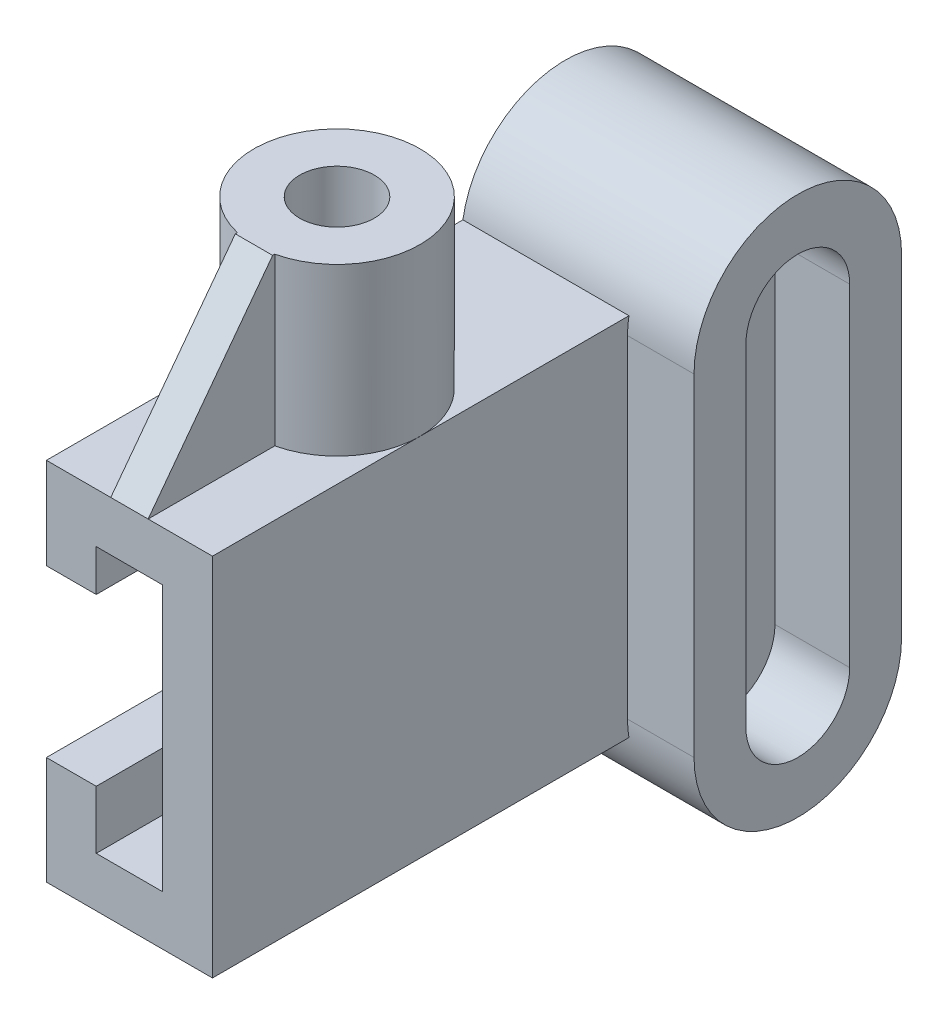
ISO-10303-21;
HEADER;
FILE_DESCRIPTION(('STEP AP214'),'2;1');
FILE_NAME('part.step','',(''),(''),'','','');
FILE_SCHEMA(('AUTOMOTIVE_DESIGN { 1 0 10303 214 1 1 1 1 }'));
ENDSEC;
DATA;
#1=APPLICATION_CONTEXT('core data for automotive mechanical design processes');
#2=APPLICATION_PROTOCOL_DEFINITION('international standard','automotive_design',2000,#1);
#3=PRODUCT_CONTEXT('',#1,'mechanical');
#4=PRODUCT('Part','Part','',(#3));
#5=PRODUCT_RELATED_PRODUCT_CATEGORY('part','',(#4));
#6=PRODUCT_DEFINITION_FORMATION('','',#4);
#7=PRODUCT_DEFINITION_CONTEXT('part definition',#1,'design');
#8=PRODUCT_DEFINITION('design','',#6,#7);
#9=PRODUCT_DEFINITION_SHAPE('','',#8);
#10=(LENGTH_UNIT() NAMED_UNIT(*) SI_UNIT(.MILLI.,.METRE.));
#11=(NAMED_UNIT(*) PLANE_ANGLE_UNIT() SI_UNIT($,.RADIAN.));
#12=(NAMED_UNIT(*) SI_UNIT($,.STERADIAN.) SOLID_ANGLE_UNIT());
#13=UNCERTAINTY_MEASURE_WITH_UNIT(LENGTH_MEASURE(1.E-05),#10,'distance_accuracy_value','');
#14=(GEOMETRIC_REPRESENTATION_CONTEXT(3) GLOBAL_UNCERTAINTY_ASSIGNED_CONTEXT((#13)) GLOBAL_UNIT_ASSIGNED_CONTEXT((#10,
#11,#12)) REPRESENTATION_CONTEXT('',''));
#15=CARTESIAN_POINT('',(0.,0.,0.));
#16=DIRECTION('',(0.,0.,1.));
#17=DIRECTION('',(1.,0.,0.));
#18=AXIS2_PLACEMENT_3D('',#15,#16,#17);
#19=CARTESIAN_POINT('',(-28.,44.,21.));
#20=DIRECTION('',(0.,1.,0.));
#21=DIRECTION('',(0.,0.,1.));
#22=AXIS2_PLACEMENT_3D('',#19,#20,#21);
#23=PLANE('',#22);
#24=CARTESIAN_POINT('',(-8.,44.,75.));
#25=DIRECTION('',(0.,1.,0.));
#26=DIRECTION('',(0.,0.,1.));
#27=AXIS2_PLACEMENT_3D('',#24,#25,#26);
#28=CIRCLE('',#27,20.);
#29=CARTESIAN_POINT('',(-3.5,44.,94.4871752699051));
#30=VERTEX_POINT('',#29);
#31=CARTESIAN_POINT('',(12.,44.,75.));
#32=VERTEX_POINT('',#31);
#33=EDGE_CURVE('E250',#30,#32,#28,.T.);
#34=ORIENTED_EDGE('',*,*,#33,.F.);
#35=DIRECTION('',(0.,0.,1.));
#36=VECTOR('',#35,1.);
#37=CARTESIAN_POINT('',(-3.5,44.,21.));
#38=LINE('',#37,#36);
#39=CARTESIAN_POINT('',(-3.5,44.,125.));
#40=VERTEX_POINT('',#39);
#41=EDGE_CURVE('E64',#30,#40,#38,.T.);
#42=ORIENTED_EDGE('',*,*,#41,.T.);
#43=DIRECTION('',(-1.,0.,0.));
#44=VECTOR('',#43,1.);
#45=CARTESIAN_POINT('',(-28.,44.,125.));
#46=LINE('',#45,#44);
#47=CARTESIAN_POINT('',(12.,44.,125.));
#48=VERTEX_POINT('',#47);
#49=EDGE_CURVE('E285',#48,#40,#46,.T.);
#50=ORIENTED_EDGE('',*,*,#49,.F.);
#51=DIRECTION('',(0.,0.,1.));
#52=VECTOR('',#51,1.);
#53=CARTESIAN_POINT('',(12.,44.,21.));
#54=LINE('',#53,#52);
#55=EDGE_CURVE('E296',#32,#48,#54,.T.);
#56=ORIENTED_EDGE('',*,*,#55,.F.);
#57=EDGE_LOOP('',(#34,#42,#50,#56));
#58=FACE_BOUND('',#57,.T.);
#59=ADVANCED_FACE('F41',(#58),#23,.T.);
#60=DIRECTION('',(0.,0.,1.));
#61=VECTOR('',#60,1.);
#62=CARTESIAN_POINT('',(-28.,44.,21.));
#63=LINE('',#62,#61);
#64=CARTESIAN_POINT('',(-28.,44.,24.6779253585061));
#65=VERTEX_POINT('',#64);
#66=CARTESIAN_POINT('',(-28.,44.,75.));
#67=VERTEX_POINT('',#66);
#68=EDGE_CURVE('E288',#65,#67,#63,.T.);
#69=ORIENTED_EDGE('',*,*,#68,.T.);
#70=EDGE_CURVE('E253',#32,#67,#28,.T.);
#71=ORIENTED_EDGE('',*,*,#70,.F.);
#72=CARTESIAN_POINT('',(12.,44.,24.6779253585061));
#73=VERTEX_POINT('',#72);
#74=EDGE_CURVE('E293',#73,#32,#54,.T.);
#75=ORIENTED_EDGE('',*,*,#74,.F.);
#76=DIRECTION('',(-1.,0.,0.));
#77=VECTOR('',#76,1.);
#78=CARTESIAN_POINT('',(28.,44.,24.6779253585061));
#79=LINE('',#78,#77);
#80=EDGE_CURVE('E49',#65,#73,#79,.F.);
#81=ORIENTED_EDGE('',*,*,#80,.F.);
#82=EDGE_LOOP('',(#69,#71,#75,#81));
#83=FACE_BOUND('',#82,.T.);
#84=ADVANCED_FACE('F412',(#83),#23,.T.);
#85=CARTESIAN_POINT('',(28.,40.,25.));
#86=DIRECTION('',(0.,0.,-1.));
#87=DIRECTION('',(0.,1.,0.));
#88=AXIS2_PLACEMENT_3D('',#85,#86,#87);
#89=PLANE('',#88);
#90=DIRECTION('',(-1.,0.,0.));
#91=VECTOR('',#90,1.);
#92=CARTESIAN_POINT('',(28.,40.,25.));
#93=LINE('',#92,#91);
#94=CARTESIAN_POINT('',(28.,40.,25.));
#95=VERTEX_POINT('',#94);
#96=CARTESIAN_POINT('',(12.,40.,25.));
#97=VERTEX_POINT('',#96);
#98=EDGE_CURVE('E379',#95,#97,#93,.T.);
#99=ORIENTED_EDGE('',*,*,#98,.T.);
#100=DIRECTION('',(0.,-1.,0.));
#101=VECTOR('',#100,1.);
#102=CARTESIAN_POINT('',(12.,40.,25.));
#103=LINE('',#102,#101);
#104=CARTESIAN_POINT('',(12.,-40.,25.));
#105=VERTEX_POINT('',#104);
#106=EDGE_CURVE('E291',#97,#105,#103,.T.);
#107=ORIENTED_EDGE('',*,*,#106,.T.);
#108=DIRECTION('',(-1.,0.,0.));
#109=VECTOR('',#108,1.);
#110=CARTESIAN_POINT('',(28.,-40.,25.));
#111=LINE('',#110,#109);
#112=CARTESIAN_POINT('',(28.,-40.,25.));
#113=VERTEX_POINT('',#112);
#114=EDGE_CURVE('E376',#113,#105,#111,.T.);
#115=ORIENTED_EDGE('',*,*,#114,.F.);
#116=DIRECTION('',(0.,-1.,0.));
#117=VECTOR('',#116,1.);
#118=CARTESIAN_POINT('',(28.,40.,25.));
#119=LINE('',#118,#117);
#120=EDGE_CURVE('E357',#95,#113,#119,.T.);
#121=ORIENTED_EDGE('',*,*,#120,.F.);
#122=EDGE_LOOP('',(#99,#107,#115,#121));
#123=FACE_BOUND('',#122,.T.);
#124=ADVANCED_FACE('F434',(#123),#89,.F.);
#125=CARTESIAN_POINT('',(28.,40.,0.));
#126=DIRECTION('',(1.,0.,0.));
#127=DIRECTION('',(0.,0.,-1.));
#128=AXIS2_PLACEMENT_3D('',#125,#126,#127);
#129=PLANE('',#128);
#130=CARTESIAN_POINT('',(28.,40.,0.));
#131=DIRECTION('',(1.,0.,0.));
#132=DIRECTION('',(0.,0.,-1.));
#133=AXIS2_PLACEMENT_3D('',#130,#131,#132);
#134=CIRCLE('',#133,25.);
#135=CARTESIAN_POINT('',(28.,40.,-25.));
#136=VERTEX_POINT('',#135);
#137=EDGE_CURVE('E354',#136,#95,#134,.T.);
#138=ORIENTED_EDGE('',*,*,#137,.T.);
#139=ORIENTED_EDGE('',*,*,#120,.T.);
#140=CARTESIAN_POINT('',(28.,-40.,0.));
#141=DIRECTION('',(1.,0.,0.));
#142=DIRECTION('',(0.,0.,-1.));
#143=AXIS2_PLACEMENT_3D('',#140,#141,#142);
#144=CIRCLE('',#143,25.);
#145=CARTESIAN_POINT('',(28.,-40.,-25.));
#146=VERTEX_POINT('',#145);
#147=EDGE_CURVE('E360',#113,#146,#144,.T.);
#148=ORIENTED_EDGE('',*,*,#147,.T.);
#149=DIRECTION('',(0.,1.,0.));
#150=VECTOR('',#149,1.);
#151=CARTESIAN_POINT('',(28.,40.,-25.));
#152=LINE('',#151,#150);
#153=EDGE_CURVE('E362',#146,#136,#152,.T.);
#154=ORIENTED_EDGE('',*,*,#153,.T.);
#155=EDGE_LOOP('',(#138,#139,#148,#154));
#156=FACE_BOUND('',#155,.T.);
#157=DIRECTION('',(0.,-1.,0.));
#158=VECTOR('',#157,1.);
#159=CARTESIAN_POINT('',(28.,40.,12.5));
#160=LINE('',#159,#158);
#161=CARTESIAN_POINT('',(28.,40.,12.5));
#162=VERTEX_POINT('',#161);
#163=CARTESIAN_POINT('',(28.,-40.,12.5));
#164=VERTEX_POINT('',#163);
#165=EDGE_CURVE('E335',#162,#164,#160,.T.);
#166=ORIENTED_EDGE('',*,*,#165,.F.);
#167=CARTESIAN_POINT('',(28.,40.,0.));
#168=DIRECTION('',(1.,0.,0.));
#169=DIRECTION('',(0.,0.,-1.));
#170=AXIS2_PLACEMENT_3D('',#167,#168,#169);
#171=CIRCLE('',#170,12.5);
#172=CARTESIAN_POINT('',(28.,40.,-12.5));
#173=VERTEX_POINT('',#172);
#174=EDGE_CURVE('E333',#173,#162,#171,.T.);
#175=ORIENTED_EDGE('',*,*,#174,.F.);
#176=DIRECTION('',(0.,1.,0.));
#177=VECTOR('',#176,1.);
#178=CARTESIAN_POINT('',(28.,40.,-12.5));
#179=LINE('',#178,#177);
#180=CARTESIAN_POINT('',(28.,-40.,-12.5));
#181=VERTEX_POINT('',#180);
#182=EDGE_CURVE('E340',#181,#173,#179,.T.);
#183=ORIENTED_EDGE('',*,*,#182,.F.);
#184=CARTESIAN_POINT('',(28.,-40.,0.));
#185=DIRECTION('',(1.,0.,0.));
#186=DIRECTION('',(0.,0.,-1.));
#187=AXIS2_PLACEMENT_3D('',#184,#185,#186);
#188=CIRCLE('',#187,12.5);
#189=EDGE_CURVE('E337',#164,#181,#188,.T.);
#190=ORIENTED_EDGE('',*,*,#189,.F.);
#191=EDGE_LOOP('',(#166,#175,#183,#190));
#192=FACE_BOUND('',#191,.T.);
#193=ADVANCED_FACE('F438',(#156,#192),#129,.T.);
#194=CARTESIAN_POINT('',(-28.,40.,0.));
#195=DIRECTION('',(1.,0.,0.));
#196=DIRECTION('',(0.,0.,-1.));
#197=AXIS2_PLACEMENT_3D('',#194,#195,#196);
#198=PLANE('',#197);
#199=ORIENTED_EDGE('',*,*,#68,.F.);
#200=CARTESIAN_POINT('',(-28.,40.,0.));
#201=DIRECTION('',(1.,0.,0.));
#202=DIRECTION('',(0.,0.,-1.));
#203=AXIS2_PLACEMENT_3D('',#200,#201,#202);
#204=CIRCLE('',#203,25.);
#205=CARTESIAN_POINT('',(-28.,40.,-25.));
#206=VERTEX_POINT('',#205);
#207=EDGE_CURVE('E353',#206,#65,#204,.T.);
#208=ORIENTED_EDGE('',*,*,#207,.F.);
#209=DIRECTION('',(0.,1.,0.));
#210=VECTOR('',#209,1.);
#211=CARTESIAN_POINT('',(-28.,40.,-25.));
#212=LINE('',#211,#210);
#213=CARTESIAN_POINT('',(-28.,-40.,-25.));
#214=VERTEX_POINT('',#213);
#215=EDGE_CURVE('E358',#214,#206,#212,.T.);
#216=ORIENTED_EDGE('',*,*,#215,.F.);
#217=CARTESIAN_POINT('',(-28.,-40.,0.));
#218=DIRECTION('',(1.,0.,0.));
#219=DIRECTION('',(0.,0.,-1.));
#220=AXIS2_PLACEMENT_3D('',#217,#218,#219);
#221=CIRCLE('',#220,25.);
#222=CARTESIAN_POINT('',(-28.,-44.,24.6779253585061));
#223=VERTEX_POINT('',#222);
#224=EDGE_CURVE('E368',#223,#214,#221,.T.);
#225=ORIENTED_EDGE('',*,*,#224,.F.);
#226=DIRECTION('',(0.,0.,1.));
#227=VECTOR('',#226,1.);
#228=CARTESIAN_POINT('',(-28.,-44.,21.));
#229=LINE('',#228,#227);
#230=CARTESIAN_POINT('',(-28.,-44.,125.));
#231=VERTEX_POINT('',#230);
#232=EDGE_CURVE('E300',#223,#231,#229,.T.);
#233=ORIENTED_EDGE('',*,*,#232,.T.);
#234=DIRECTION('',(0.,-1.,0.));
#235=VECTOR('',#234,1.);
#236=CARTESIAN_POINT('',(-28.,-44.,125.));
#237=LINE('',#236,#235);
#238=CARTESIAN_POINT('',(-28.,-18.,125.));
#239=VERTEX_POINT('',#238);
#240=EDGE_CURVE('E277',#239,#231,#237,.T.);
#241=ORIENTED_EDGE('',*,*,#240,.F.);
#242=DIRECTION('',(0.,0.,1.));
#243=VECTOR('',#242,1.);
#244=CARTESIAN_POINT('',(-28.,-18.,21.));
#245=LINE('',#244,#243);
#246=CARTESIAN_POINT('',(-28.,-18.,25.));
#247=VERTEX_POINT('',#246);
#248=EDGE_CURVE('E302',#247,#239,#245,.T.);
#249=ORIENTED_EDGE('',*,*,#248,.F.);
#250=DIRECTION('',(0.,-1.,0.));
#251=VECTOR('',#250,1.);
#252=CARTESIAN_POINT('',(-28.,40.,25.));
#253=LINE('',#252,#251);
#254=CARTESIAN_POINT('',(-28.,22.,25.));
#255=VERTEX_POINT('',#254);
#256=EDGE_CURVE('E366',#255,#247,#253,.T.);
#257=ORIENTED_EDGE('',*,*,#256,.F.);
#258=DIRECTION('',(0.,0.,1.));
#259=VECTOR('',#258,1.);
#260=CARTESIAN_POINT('',(-28.,22.,21.));
#261=LINE('',#260,#259);
#262=CARTESIAN_POINT('',(-28.,22.,125.));
#263=VERTEX_POINT('',#262);
#264=EDGE_CURVE('E287',#255,#263,#261,.T.);
#265=ORIENTED_EDGE('',*,*,#264,.T.);
#266=DIRECTION('',(0.,-1.,0.));
#267=VECTOR('',#266,1.);
#268=CARTESIAN_POINT('',(-28.,22.,125.));
#269=LINE('',#268,#267);
#270=CARTESIAN_POINT('',(-28.,44.,125.));
#271=VERTEX_POINT('',#270);
#272=EDGE_CURVE('E252',#271,#263,#269,.T.);
#273=ORIENTED_EDGE('',*,*,#272,.F.);
#274=EDGE_CURVE('E292',#67,#271,#63,.T.);
#275=ORIENTED_EDGE('',*,*,#274,.F.);
#276=EDGE_LOOP('',(#199,#208,#216,#225,#233,#241,#249,#257,#265,#273,#275));
#277=FACE_BOUND('',#276,.T.);
#278=ADVANCED_FACE('F445',(#277),#198,.F.);
#279=CARTESIAN_POINT('',(28.,40.,0.));
#280=DIRECTION('',(-1.,0.,0.));
#281=DIRECTION('',(0.,0.,1.));
#282=AXIS2_PLACEMENT_3D('',#279,#280,#281);
#283=CYLINDRICAL_SURFACE('',#282,25.);
#284=ORIENTED_EDGE('',*,*,#80,.T.);
#285=CARTESIAN_POINT('',(12.,40.,0.));
#286=DIRECTION('',(1.,0.,0.));
#287=DIRECTION('',(0.,1.,0.));
#288=AXIS2_PLACEMENT_3D('',#285,#286,#287);
#289=CIRCLE('',#288,25.);
#290=EDGE_CURVE('E320',#73,#97,#289,.T.);
#291=ORIENTED_EDGE('',*,*,#290,.T.);
#292=ORIENTED_EDGE('',*,*,#98,.F.);
#293=ORIENTED_EDGE('',*,*,#137,.F.);
#294=DIRECTION('',(-1.,0.,0.));
#295=VECTOR('',#294,1.);
#296=CARTESIAN_POINT('',(28.,40.,-25.));
#297=LINE('',#296,#295);
#298=EDGE_CURVE('E364',#136,#206,#297,.T.);
#299=ORIENTED_EDGE('',*,*,#298,.T.);
#300=ORIENTED_EDGE('',*,*,#207,.T.);
#301=EDGE_LOOP('',(#284,#291,#292,#293,#299,#300));
#302=FACE_BOUND('',#301,.T.);
#303=ADVANCED_FACE('F43',(#302),#283,.T.);
#304=DIRECTION('',(1.,0.,0.));
#305=VECTOR('',#304,1.);
#306=CARTESIAN_POINT('',(28.,-32.,25.));
#307=LINE('',#306,#305);
#308=CARTESIAN_POINT('',(-16.,-32.,25.));
#309=VERTEX_POINT('',#308);
#310=CARTESIAN_POINT('',(0.,-32.,25.));
#311=VERTEX_POINT('',#310);
#312=EDGE_CURVE('E394',#309,#311,#307,.T.);
#313=ORIENTED_EDGE('',*,*,#312,.T.);
#314=DIRECTION('',(0.,1.,0.));
#315=VECTOR('',#314,1.);
#316=CARTESIAN_POINT('',(0.,40.,25.));
#317=LINE('',#316,#315);
#318=CARTESIAN_POINT('',(0.,32.,25.));
#319=VERTEX_POINT('',#318);
#320=EDGE_CURVE('E392',#311,#319,#317,.T.);
#321=ORIENTED_EDGE('',*,*,#320,.T.);
#322=DIRECTION('',(-1.,0.,0.));
#323=VECTOR('',#322,1.);
#324=CARTESIAN_POINT('',(28.,32.,25.));
#325=LINE('',#324,#323);
#326=CARTESIAN_POINT('',(-16.,32.,25.));
#327=VERTEX_POINT('',#326);
#328=EDGE_CURVE('E390',#319,#327,#325,.T.);
#329=ORIENTED_EDGE('',*,*,#328,.T.);
#330=DIRECTION('',(0.,-1.,0.));
#331=VECTOR('',#330,1.);
#332=CARTESIAN_POINT('',(-16.,40.,25.));
#333=LINE('',#332,#331);
#334=CARTESIAN_POINT('',(-16.,22.,25.));
#335=VERTEX_POINT('',#334);
#336=EDGE_CURVE('E388',#327,#335,#333,.T.);
#337=ORIENTED_EDGE('',*,*,#336,.T.);
#338=DIRECTION('',(-1.,0.,0.));
#339=VECTOR('',#338,1.);
#340=CARTESIAN_POINT('',(28.,22.,25.));
#341=LINE('',#340,#339);
#342=EDGE_CURVE('E386',#335,#255,#341,.T.);
#343=ORIENTED_EDGE('',*,*,#342,.T.);
#344=ORIENTED_EDGE('',*,*,#256,.T.);
#345=DIRECTION('',(1.,0.,0.));
#346=VECTOR('',#345,1.);
#347=CARTESIAN_POINT('',(28.,-18.,25.));
#348=LINE('',#347,#346);
#349=CARTESIAN_POINT('',(-16.,-18.,25.));
#350=VERTEX_POINT('',#349);
#351=EDGE_CURVE('E398',#247,#350,#348,.T.);
#352=ORIENTED_EDGE('',*,*,#351,.T.);
#353=DIRECTION('',(0.,-1.,0.));
#354=VECTOR('',#353,1.);
#355=CARTESIAN_POINT('',(-16.,40.,25.));
#356=LINE('',#355,#354);
#357=EDGE_CURVE('E396',#350,#309,#356,.T.);
#358=ORIENTED_EDGE('',*,*,#357,.T.);
#359=EDGE_LOOP('',(#313,#321,#329,#337,#343,#344,#352,#358));
#360=FACE_BOUND('',#359,.T.);
#361=ADVANCED_FACE('F509',(#360),#89,.F.);
#362=CARTESIAN_POINT('',(28.,-40.,0.));
#363=DIRECTION('',(-1.,0.,0.));
#364=DIRECTION('',(0.,0.,1.));
#365=AXIS2_PLACEMENT_3D('',#362,#363,#364);
#366=CYLINDRICAL_SURFACE('',#365,25.);
#367=ORIENTED_EDGE('',*,*,#224,.T.);
#368=DIRECTION('',(-1.,0.,0.));
#369=VECTOR('',#368,1.);
#370=CARTESIAN_POINT('',(28.,-40.,-25.));
#371=LINE('',#370,#369);
#372=EDGE_CURVE('E374',#146,#214,#371,.T.);
#373=ORIENTED_EDGE('',*,*,#372,.F.);
#374=ORIENTED_EDGE('',*,*,#147,.F.);
#375=ORIENTED_EDGE('',*,*,#114,.T.);
#376=CARTESIAN_POINT('',(12.,-40.,0.));
#377=DIRECTION('',(1.,0.,0.));
#378=DIRECTION('',(0.,1.,0.));
#379=AXIS2_PLACEMENT_3D('',#376,#377,#378);
#380=CIRCLE('',#379,25.);
#381=CARTESIAN_POINT('',(12.,-44.,24.6779253585061));
#382=VERTEX_POINT('',#381);
#383=EDGE_CURVE('E384',#105,#382,#380,.T.);
#384=ORIENTED_EDGE('',*,*,#383,.T.);
#385=DIRECTION('',(-1.,0.,0.));
#386=VECTOR('',#385,1.);
#387=CARTESIAN_POINT('',(28.,-44.,24.6779253585061));
#388=LINE('',#387,#386);
#389=EDGE_CURVE('E382',#382,#223,#388,.T.);
#390=ORIENTED_EDGE('',*,*,#389,.T.);
#391=EDGE_LOOP('',(#367,#373,#374,#375,#384,#390));
#392=FACE_BOUND('',#391,.T.);
#393=ADVANCED_FACE('F428',(#392),#366,.T.);
#394=CARTESIAN_POINT('',(28.,40.,-25.));
#395=DIRECTION('',(0.,0.,1.));
#396=DIRECTION('',(0.,-1.,0.));
#397=AXIS2_PLACEMENT_3D('',#394,#395,#396);
#398=PLANE('',#397);
#399=ORIENTED_EDGE('',*,*,#215,.T.);
#400=ORIENTED_EDGE('',*,*,#298,.F.);
#401=ORIENTED_EDGE('',*,*,#153,.F.);
#402=ORIENTED_EDGE('',*,*,#372,.T.);
#403=EDGE_LOOP('',(#399,#400,#401,#402));
#404=FACE_BOUND('',#403,.T.);
#405=ADVANCED_FACE('F442',(#404),#398,.F.);
#406=CARTESIAN_POINT('',(28.,40.,0.));
#407=DIRECTION('',(-1.,0.,0.));
#408=DIRECTION('',(0.,0.,1.));
#409=AXIS2_PLACEMENT_3D('',#406,#407,#408);
#410=CYLINDRICAL_SURFACE('',#409,12.5);
#411=CARTESIAN_POINT('',(10.,40.,0.));
#412=DIRECTION('',(1.,0.,0.));
#413=DIRECTION('',(0.,0.,-1.));
#414=AXIS2_PLACEMENT_3D('',#411,#412,#413);
#415=CIRCLE('',#414,12.5);
#416=CARTESIAN_POINT('',(10.,40.,-12.5));
#417=VERTEX_POINT('',#416);
#418=CARTESIAN_POINT('',(10.,40.,12.5));
#419=VERTEX_POINT('',#418);
#420=EDGE_CURVE('E330',#417,#419,#415,.T.);
#421=ORIENTED_EDGE('',*,*,#420,.F.);
#422=DIRECTION('',(-1.,0.,0.));
#423=VECTOR('',#422,1.);
#424=CARTESIAN_POINT('',(28.,40.,-12.5));
#425=LINE('',#424,#423);
#426=EDGE_CURVE('E342',#173,#417,#425,.T.);
#427=ORIENTED_EDGE('',*,*,#426,.F.);
#428=ORIENTED_EDGE('',*,*,#174,.T.);
#429=DIRECTION('',(-1.,0.,0.));
#430=VECTOR('',#429,1.);
#431=CARTESIAN_POINT('',(28.,40.,12.5));
#432=LINE('',#431,#430);
#433=EDGE_CURVE('E350',#162,#419,#432,.T.);
#434=ORIENTED_EDGE('',*,*,#433,.T.);
#435=EDGE_LOOP('',(#421,#427,#428,#434));
#436=FACE_BOUND('',#435,.T.);
#437=ADVANCED_FACE('F497',(#436),#410,.F.);
#438=CARTESIAN_POINT('',(28.,40.,12.5));
#439=DIRECTION('',(0.,0.,-1.));
#440=DIRECTION('',(0.,1.,0.));
#441=AXIS2_PLACEMENT_3D('',#438,#439,#440);
#442=PLANE('',#441);
#443=DIRECTION('',(0.,-1.,0.));
#444=VECTOR('',#443,1.);
#445=CARTESIAN_POINT('',(10.,0.,12.5));
#446=LINE('',#445,#444);
#447=CARTESIAN_POINT('',(10.,-40.,12.5));
#448=VERTEX_POINT('',#447);
#449=EDGE_CURVE('E322',#419,#448,#446,.T.);
#450=ORIENTED_EDGE('',*,*,#449,.F.);
#451=ORIENTED_EDGE('',*,*,#433,.F.);
#452=ORIENTED_EDGE('',*,*,#165,.T.);
#453=DIRECTION('',(-1.,0.,0.));
#454=VECTOR('',#453,1.);
#455=CARTESIAN_POINT('',(28.,-40.,12.5));
#456=LINE('',#455,#454);
#457=EDGE_CURVE('E347',#164,#448,#456,.T.);
#458=ORIENTED_EDGE('',*,*,#457,.T.);
#459=EDGE_LOOP('',(#450,#451,#452,#458));
#460=FACE_BOUND('',#459,.T.);
#461=ADVANCED_FACE('F493',(#460),#442,.T.);
#462=CARTESIAN_POINT('',(28.,-40.,0.));
#463=DIRECTION('',(-1.,0.,0.));
#464=DIRECTION('',(0.,0.,1.));
#465=AXIS2_PLACEMENT_3D('',#462,#463,#464);
#466=CYLINDRICAL_SURFACE('',#465,12.5);
#467=CARTESIAN_POINT('',(10.,-40.,0.));
#468=DIRECTION('',(1.,0.,0.));
#469=DIRECTION('',(0.,0.,-1.));
#470=AXIS2_PLACEMENT_3D('',#467,#468,#469);
#471=CIRCLE('',#470,12.5);
#472=CARTESIAN_POINT('',(10.,-40.,-12.5));
#473=VERTEX_POINT('',#472);
#474=EDGE_CURVE('E325',#448,#473,#471,.T.);
#475=ORIENTED_EDGE('',*,*,#474,.F.);
#476=ORIENTED_EDGE('',*,*,#457,.F.);
#477=ORIENTED_EDGE('',*,*,#189,.T.);
#478=DIRECTION('',(-1.,0.,0.));
#479=VECTOR('',#478,1.);
#480=CARTESIAN_POINT('',(28.,-40.,-12.5));
#481=LINE('',#480,#479);
#482=EDGE_CURVE('E344',#181,#473,#481,.T.);
#483=ORIENTED_EDGE('',*,*,#482,.T.);
#484=EDGE_LOOP('',(#475,#476,#477,#483));
#485=FACE_BOUND('',#484,.T.);
#486=ADVANCED_FACE('F484',(#485),#466,.F.);
#487=CARTESIAN_POINT('',(28.,40.,-12.5));
#488=DIRECTION('',(0.,0.,1.));
#489=DIRECTION('',(0.,-1.,0.));
#490=AXIS2_PLACEMENT_3D('',#487,#488,#489);
#491=PLANE('',#490);
#492=DIRECTION('',(0.,-1.,0.));
#493=VECTOR('',#492,1.);
#494=CARTESIAN_POINT('',(10.,0.,-12.5));
#495=LINE('',#494,#493);
#496=EDGE_CURVE('E328',#417,#473,#495,.T.);
#497=ORIENTED_EDGE('',*,*,#496,.T.);
#498=ORIENTED_EDGE('',*,*,#482,.F.);
#499=ORIENTED_EDGE('',*,*,#182,.T.);
#500=ORIENTED_EDGE('',*,*,#426,.T.);
#501=EDGE_LOOP('',(#497,#498,#499,#500));
#502=FACE_BOUND('',#501,.T.);
#503=ADVANCED_FACE('F478',(#502),#491,.T.);
#504=CARTESIAN_POINT('',(10.,0.,0.));
#505=DIRECTION('',(1.,0.,0.));
#506=DIRECTION('',(0.,0.,-1.));
#507=AXIS2_PLACEMENT_3D('',#504,#505,#506);
#508=PLANE('',#507);
#509=ORIENTED_EDGE('',*,*,#449,.T.);
#510=ORIENTED_EDGE('',*,*,#474,.T.);
#511=ORIENTED_EDGE('',*,*,#496,.F.);
#512=ORIENTED_EDGE('',*,*,#420,.T.);
#513=EDGE_LOOP('',(#509,#510,#511,#512));
#514=FACE_BOUND('',#513,.T.);
#515=ADVANCED_FACE('F470',(#514),#508,.T.);
#516=DIRECTION('',(0.,0.,1.));
#517=VECTOR('',#516,1.);
#518=CARTESIAN_POINT('',(-12.5,44.,21.));
#519=LINE('',#518,#517);
#520=CARTESIAN_POINT('',(-12.5,44.,94.4871752699051));
#521=VERTEX_POINT('',#520);
#522=CARTESIAN_POINT('',(-12.5,44.,125.));
#523=VERTEX_POINT('',#522);
#524=EDGE_CURVE('E233',#521,#523,#519,.T.);
#525=ORIENTED_EDGE('',*,*,#524,.F.);
#526=EDGE_CURVE('E255',#67,#521,#28,.T.);
#527=ORIENTED_EDGE('',*,*,#526,.F.);
#528=ORIENTED_EDGE('',*,*,#274,.T.);
#529=EDGE_CURVE('E56',#523,#271,#46,.T.);
#530=ORIENTED_EDGE('',*,*,#529,.F.);
#531=EDGE_LOOP('',(#525,#527,#528,#530));
#532=FACE_BOUND('',#531,.T.);
#533=ADVANCED_FACE('F448',(#532),#23,.T.);
#534=CARTESIAN_POINT('',(-28.,-18.,21.));
#535=DIRECTION('',(0.,1.,0.));
#536=DIRECTION('',(0.,0.,1.));
#537=AXIS2_PLACEMENT_3D('',#534,#535,#536);
#538=PLANE('',#537);
#539=ORIENTED_EDGE('',*,*,#351,.F.);
#540=ORIENTED_EDGE('',*,*,#248,.T.);
#541=DIRECTION('',(-1.,0.,0.));
#542=VECTOR('',#541,1.);
#543=CARTESIAN_POINT('',(-28.,-18.,125.));
#544=LINE('',#543,#542);
#545=CARTESIAN_POINT('',(-16.,-18.,125.));
#546=VERTEX_POINT('',#545);
#547=EDGE_CURVE('E274',#546,#239,#544,.T.);
#548=ORIENTED_EDGE('',*,*,#547,.F.);
#549=DIRECTION('',(0.,0.,1.));
#550=VECTOR('',#549,1.);
#551=CARTESIAN_POINT('',(-16.,-18.,21.));
#552=LINE('',#551,#550);
#553=EDGE_CURVE('E304',#350,#546,#552,.T.);
#554=ORIENTED_EDGE('',*,*,#553,.F.);
#555=EDGE_LOOP('',(#539,#540,#548,#554));
#556=FACE_BOUND('',#555,.T.);
#557=ADVANCED_FACE('F469',(#556),#538,.T.);
#558=CARTESIAN_POINT('',(-16.,-18.,21.));
#559=DIRECTION('',(1.,0.,0.));
#560=DIRECTION('',(0.,1.,0.));
#561=AXIS2_PLACEMENT_3D('',#558,#559,#560);
#562=PLANE('',#561);
#563=ORIENTED_EDGE('',*,*,#357,.F.);
#564=ORIENTED_EDGE('',*,*,#553,.T.);
#565=DIRECTION('',(0.,1.,0.));
#566=VECTOR('',#565,1.);
#567=CARTESIAN_POINT('',(-16.,-18.,125.));
#568=LINE('',#567,#566);
#569=CARTESIAN_POINT('',(-16.,-32.,125.));
#570=VERTEX_POINT('',#569);
#571=EDGE_CURVE('E271',#570,#546,#568,.T.);
#572=ORIENTED_EDGE('',*,*,#571,.F.);
#573=DIRECTION('',(0.,0.,1.));
#574=VECTOR('',#573,1.);
#575=CARTESIAN_POINT('',(-16.,-32.,21.));
#576=LINE('',#575,#574);
#577=EDGE_CURVE('E306',#309,#570,#576,.T.);
#578=ORIENTED_EDGE('',*,*,#577,.F.);
#579=EDGE_LOOP('',(#563,#564,#572,#578));
#580=FACE_BOUND('',#579,.T.);
#581=ADVANCED_FACE('F475',(#580),#562,.T.);
#582=CARTESIAN_POINT('',(-16.,-32.,21.));
#583=DIRECTION('',(0.,1.,0.));
#584=DIRECTION('',(0.,0.,1.));
#585=AXIS2_PLACEMENT_3D('',#582,#583,#584);
#586=PLANE('',#585);
#587=ORIENTED_EDGE('',*,*,#577,.T.);
#588=DIRECTION('',(-1.,0.,0.));
#589=VECTOR('',#588,1.);
#590=CARTESIAN_POINT('',(-16.,-32.,125.));
#591=LINE('',#590,#589);
#592=CARTESIAN_POINT('',(0.,-32.,125.));
#593=VERTEX_POINT('',#592);
#594=EDGE_CURVE('E269',#593,#570,#591,.T.);
#595=ORIENTED_EDGE('',*,*,#594,.F.);
#596=DIRECTION('',(0.,0.,1.));
#597=VECTOR('',#596,1.);
#598=CARTESIAN_POINT('',(0.,-32.,21.));
#599=LINE('',#598,#597);
#600=EDGE_CURVE('E309',#311,#593,#599,.T.);
#601=ORIENTED_EDGE('',*,*,#600,.F.);
#602=ORIENTED_EDGE('',*,*,#312,.F.);
#603=EDGE_LOOP('',(#587,#595,#601,#602));
#604=FACE_BOUND('',#603,.T.);
#605=ADVANCED_FACE('F571',(#604),#586,.T.);
#606=CARTESIAN_POINT('',(0.,-32.,21.));
#607=DIRECTION('',(-1.,0.,0.));
#608=DIRECTION('',(0.,-1.,0.));
#609=AXIS2_PLACEMENT_3D('',#606,#607,#608);
#610=PLANE('',#609);
#611=ORIENTED_EDGE('',*,*,#320,.F.);
#612=ORIENTED_EDGE('',*,*,#600,.T.);
#613=DIRECTION('',(0.,-1.,0.));
#614=VECTOR('',#613,1.);
#615=CARTESIAN_POINT('',(0.,-32.,125.));
#616=LINE('',#615,#614);
#617=CARTESIAN_POINT('',(0.,32.,125.));
#618=VERTEX_POINT('',#617);
#619=EDGE_CURVE('E266',#618,#593,#616,.T.);
#620=ORIENTED_EDGE('',*,*,#619,.F.);
#621=DIRECTION('',(0.,0.,1.));
#622=VECTOR('',#621,1.);
#623=CARTESIAN_POINT('',(0.,32.,21.));
#624=LINE('',#623,#622);
#625=EDGE_CURVE('E311',#319,#618,#624,.T.);
#626=ORIENTED_EDGE('',*,*,#625,.F.);
#627=EDGE_LOOP('',(#611,#612,#620,#626));
#628=FACE_BOUND('',#627,.T.);
#629=ADVANCED_FACE('F576',(#628),#610,.T.);
#630=CARTESIAN_POINT('',(0.,32.,21.));
#631=DIRECTION('',(0.,-1.,0.));
#632=DIRECTION('',(0.,0.,-1.));
#633=AXIS2_PLACEMENT_3D('',#630,#631,#632);
#634=PLANE('',#633);
#635=DIRECTION('',(0.,0.,1.));
#636=VECTOR('',#635,1.);
#637=CARTESIAN_POINT('',(-16.,32.,21.));
#638=LINE('',#637,#636);
#639=CARTESIAN_POINT('',(-16.,32.,125.));
#640=VERTEX_POINT('',#639);
#641=EDGE_CURVE('E314',#327,#640,#638,.T.);
#642=ORIENTED_EDGE('',*,*,#641,.F.);
#643=ORIENTED_EDGE('',*,*,#328,.F.);
#644=ORIENTED_EDGE('',*,*,#625,.T.);
#645=DIRECTION('',(1.,0.,0.));
#646=VECTOR('',#645,1.);
#647=CARTESIAN_POINT('',(0.,32.,125.));
#648=LINE('',#647,#646);
#649=EDGE_CURVE('E264',#640,#618,#648,.T.);
#650=ORIENTED_EDGE('',*,*,#649,.F.);
#651=EDGE_LOOP('',(#642,#643,#644,#650));
#652=FACE_BOUND('',#651,.T.);
#653=ADVANCED_FACE('F587',(#652),#634,.T.);
#654=CARTESIAN_POINT('',(-16.,32.,21.));
#655=DIRECTION('',(1.,0.,0.));
#656=DIRECTION('',(0.,0.,-1.));
#657=AXIS2_PLACEMENT_3D('',#654,#655,#656);
#658=PLANE('',#657);
#659=ORIENTED_EDGE('',*,*,#336,.F.);
#660=ORIENTED_EDGE('',*,*,#641,.T.);
#661=DIRECTION('',(0.,1.,0.));
#662=VECTOR('',#661,1.);
#663=CARTESIAN_POINT('',(-16.,32.,125.));
#664=LINE('',#663,#662);
#665=CARTESIAN_POINT('',(-16.,22.,125.));
#666=VERTEX_POINT('',#665);
#667=EDGE_CURVE('E261',#666,#640,#664,.T.);
#668=ORIENTED_EDGE('',*,*,#667,.F.);
#669=DIRECTION('',(0.,0.,1.));
#670=VECTOR('',#669,1.);
#671=CARTESIAN_POINT('',(-16.,22.,21.));
#672=LINE('',#671,#670);
#673=EDGE_CURVE('E316',#335,#666,#672,.T.);
#674=ORIENTED_EDGE('',*,*,#673,.F.);
#675=EDGE_LOOP('',(#659,#660,#668,#674));
#676=FACE_BOUND('',#675,.T.);
#677=ADVANCED_FACE('F592',(#676),#658,.T.);
#678=CARTESIAN_POINT('',(-16.,22.,21.));
#679=DIRECTION('',(0.,-1.,0.));
#680=DIRECTION('',(0.,0.,-1.));
#681=AXIS2_PLACEMENT_3D('',#678,#679,#680);
#682=PLANE('',#681);
#683=ORIENTED_EDGE('',*,*,#342,.F.);
#684=ORIENTED_EDGE('',*,*,#673,.T.);
#685=DIRECTION('',(1.,0.,0.));
#686=VECTOR('',#685,1.);
#687=CARTESIAN_POINT('',(-16.,22.,125.));
#688=LINE('',#687,#686);
#689=EDGE_CURVE('E258',#263,#666,#688,.T.);
#690=ORIENTED_EDGE('',*,*,#689,.F.);
#691=ORIENTED_EDGE('',*,*,#264,.F.);
#692=EDGE_LOOP('',(#683,#684,#690,#691));
#693=FACE_BOUND('',#692,.T.);
#694=ADVANCED_FACE('F488',(#693),#682,.T.);
#695=CARTESIAN_POINT('',(12.,-44.,21.));
#696=DIRECTION('',(0.,-1.,0.));
#697=DIRECTION('',(1.,0.,0.));
#698=AXIS2_PLACEMENT_3D('',#695,#696,#697);
#699=PLANE('',#698);
#700=ORIENTED_EDGE('',*,*,#232,.F.);
#701=ORIENTED_EDGE('',*,*,#389,.F.);
#702=DIRECTION('',(0.,0.,1.));
#703=VECTOR('',#702,1.);
#704=CARTESIAN_POINT('',(12.,-44.,21.));
#705=LINE('',#704,#703);
#706=CARTESIAN_POINT('',(12.,-44.,125.));
#707=VERTEX_POINT('',#706);
#708=EDGE_CURVE('E297',#382,#707,#705,.T.);
#709=ORIENTED_EDGE('',*,*,#708,.T.);
#710=DIRECTION('',(1.,0.,0.));
#711=VECTOR('',#710,1.);
#712=CARTESIAN_POINT('',(12.,-44.,125.));
#713=LINE('',#712,#711);
#714=EDGE_CURVE('E280',#231,#707,#713,.T.);
#715=ORIENTED_EDGE('',*,*,#714,.F.);
#716=EDGE_LOOP('',(#700,#701,#709,#715));
#717=FACE_BOUND('',#716,.T.);
#718=ADVANCED_FACE('F426',(#717),#699,.T.);
#719=CARTESIAN_POINT('',(12.,44.,21.));
#720=DIRECTION('',(1.,0.,0.));
#721=DIRECTION('',(0.,1.,0.));
#722=AXIS2_PLACEMENT_3D('',#719,#720,#721);
#723=PLANE('',#722);
#724=ORIENTED_EDGE('',*,*,#290,.F.);
#725=ORIENTED_EDGE('',*,*,#74,.T.);
#726=ORIENTED_EDGE('',*,*,#55,.T.);
#727=DIRECTION('',(0.,1.,0.));
#728=VECTOR('',#727,1.);
#729=CARTESIAN_POINT('',(12.,44.,125.));
#730=LINE('',#729,#728);
#731=EDGE_CURVE('E282',#707,#48,#730,.T.);
#732=ORIENTED_EDGE('',*,*,#731,.F.);
#733=ORIENTED_EDGE('',*,*,#708,.F.);
#734=ORIENTED_EDGE('',*,*,#383,.F.);
#735=ORIENTED_EDGE('',*,*,#106,.F.);
#736=EDGE_LOOP('',(#724,#725,#726,#732,#733,#734,#735));
#737=FACE_BOUND('',#736,.T.);
#738=ADVANCED_FACE('F409',(#737),#723,.T.);
#739=CARTESIAN_POINT('',(0.,0.,125.));
#740=DIRECTION('',(0.,0.,-1.));
#741=DIRECTION('',(-1.,0.,0.));
#742=AXIS2_PLACEMENT_3D('',#739,#740,#741);
#743=PLANE('',#742);
#744=ORIENTED_EDGE('',*,*,#649,.T.);
#745=ORIENTED_EDGE('',*,*,#619,.T.);
#746=ORIENTED_EDGE('',*,*,#594,.T.);
#747=ORIENTED_EDGE('',*,*,#571,.T.);
#748=ORIENTED_EDGE('',*,*,#547,.T.);
#749=ORIENTED_EDGE('',*,*,#240,.T.);
#750=ORIENTED_EDGE('',*,*,#714,.T.);
#751=ORIENTED_EDGE('',*,*,#731,.T.);
#752=ORIENTED_EDGE('',*,*,#49,.T.);
#753=DIRECTION('',(-1.,0.,0.));
#754=VECTOR('',#753,1.);
#755=CARTESIAN_POINT('',(0.,44.,125.));
#756=LINE('',#755,#754);
#757=EDGE_CURVE('E245',#523,#40,#756,.F.);
#758=ORIENTED_EDGE('',*,*,#757,.F.);
#759=ORIENTED_EDGE('',*,*,#529,.T.);
#760=ORIENTED_EDGE('',*,*,#272,.T.);
#761=ORIENTED_EDGE('',*,*,#689,.T.);
#762=ORIENTED_EDGE('',*,*,#667,.T.);
#763=EDGE_LOOP('',(#744,#745,#746,#747,#748,#749,#750,#751,#752,#758,#759,#760,#761,#762));
#764=FACE_BOUND('',#763,.T.);
#765=ADVANCED_FACE('F420',(#764),#743,.F.);
#766=CARTESIAN_POINT('',(-8.,84.,75.));
#767=DIRECTION('',(0.,1.,0.));
#768=DIRECTION('',(0.,0.,1.));
#769=AXIS2_PLACEMENT_3D('',#766,#767,#768);
#770=PLANE('',#769);
#771=CARTESIAN_POINT('',(-8.,84.,75.));
#772=DIRECTION('',(0.,1.,0.));
#773=DIRECTION('',(0.,0.,1.));
#774=AXIS2_PLACEMENT_3D('',#771,#772,#773);
#775=CIRCLE('',#774,9.);
#776=CARTESIAN_POINT('',(-8.,84.,84.));
#777=VERTEX_POINT('',#776);
#778=EDGE_CURVE('E247',#777,#777,#775,.T.);
#779=ORIENTED_EDGE('',*,*,#778,.F.);
#780=EDGE_LOOP('',(#779));
#781=FACE_BOUND('',#780,.T.);
#782=CARTESIAN_POINT('',(-8.,84.,75.));
#783=DIRECTION('',(0.,1.,0.));
#784=DIRECTION('',(0.,0.,1.));
#785=AXIS2_PLACEMENT_3D('',#782,#783,#784);
#786=CIRCLE('',#785,20.);
#787=CARTESIAN_POINT('',(-3.5,84.,94.4871752699051));
#788=VERTEX_POINT('',#787);
#789=CARTESIAN_POINT('',(-12.5,84.,94.4871752699051));
#790=VERTEX_POINT('',#789);
#791=EDGE_CURVE('E226',#788,#790,#786,.T.);
#792=ORIENTED_EDGE('',*,*,#791,.T.);
#793=DIRECTION('',(0.,0.,1.));
#794=VECTOR('',#793,1.);
#795=CARTESIAN_POINT('',(-12.5,84.,50.));
#796=LINE('',#795,#794);
#797=CARTESIAN_POINT('',(-12.5,84.,95.));
#798=VERTEX_POINT('',#797);
#799=EDGE_CURVE('E224',#790,#798,#796,.T.);
#800=ORIENTED_EDGE('',*,*,#799,.T.);
#801=DIRECTION('',(-1.,0.,0.));
#802=VECTOR('',#801,1.);
#803=CARTESIAN_POINT('',(-8.,84.,95.));
#804=LINE('',#803,#802);
#805=CARTESIAN_POINT('',(-3.5,84.,95.));
#806=VERTEX_POINT('',#805);
#807=EDGE_CURVE('E211',#806,#798,#804,.T.);
#808=ORIENTED_EDGE('',*,*,#807,.F.);
#809=DIRECTION('',(0.,0.,1.));
#810=VECTOR('',#809,1.);
#811=CARTESIAN_POINT('',(-3.5,84.,50.));
#812=LINE('',#811,#810);
#813=EDGE_CURVE('E237',#788,#806,#812,.T.);
#814=ORIENTED_EDGE('',*,*,#813,.F.);
#815=EDGE_LOOP('',(#792,#800,#808,#814));
#816=FACE_BOUND('',#815,.T.);
#817=ADVANCED_FACE('F225',(#781,#816),#770,.T.);
#818=CARTESIAN_POINT('',(-8.,84.,75.));
#819=DIRECTION('',(0.,-1.,0.));
#820=DIRECTION('',(0.,0.,-1.));
#821=AXIS2_PLACEMENT_3D('',#818,#819,#820);
#822=CYLINDRICAL_SURFACE('',#821,20.);
#823=DIRECTION('',(0.,-1.,0.));
#824=VECTOR('',#823,1.);
#825=CARTESIAN_POINT('',(-12.5,84.,94.4871752699051));
#826=LINE('',#825,#824);
#827=EDGE_CURVE('E242',#521,#790,#826,.F.);
#828=ORIENTED_EDGE('',*,*,#827,.T.);
#829=ORIENTED_EDGE('',*,*,#791,.F.);
#830=DIRECTION('',(0.,-1.,0.));
#831=VECTOR('',#830,1.);
#832=CARTESIAN_POINT('',(-3.5,84.,94.4871752699051));
#833=LINE('',#832,#831);
#834=EDGE_CURVE('E221',#30,#788,#833,.F.);
#835=ORIENTED_EDGE('',*,*,#834,.F.);
#836=ORIENTED_EDGE('',*,*,#33,.T.);
#837=ORIENTED_EDGE('',*,*,#70,.T.);
#838=ORIENTED_EDGE('',*,*,#526,.T.);
#839=EDGE_LOOP('',(#828,#829,#835,#836,#837,#838));
#840=FACE_BOUND('',#839,.T.);
#841=ADVANCED_FACE('F449',(#840),#822,.T.);
#842=CARTESIAN_POINT('',(-8.,84.,75.));
#843=DIRECTION('',(0.,-1.,0.));
#844=DIRECTION('',(0.,0.,-1.));
#845=AXIS2_PLACEMENT_3D('',#842,#843,#844);
#846=CYLINDRICAL_SURFACE('',#845,9.);
#847=CARTESIAN_POINT('',(-8.,52.,75.));
#848=DIRECTION('',(0.,1.,0.));
#849=DIRECTION('',(0.,0.,1.));
#850=AXIS2_PLACEMENT_3D('',#847,#848,#849);
#851=CIRCLE('',#850,9.);
#852=CARTESIAN_POINT('',(-8.,52.,84.));
#853=VERTEX_POINT('',#852);
#854=EDGE_CURVE('E11',#853,#853,#851,.T.);
#855=ORIENTED_EDGE('',*,*,#854,.F.);
#856=EDGE_LOOP('',(#855));
#857=FACE_BOUND('',#856,.T.);
#858=ORIENTED_EDGE('',*,*,#778,.T.);
#859=EDGE_LOOP('',(#858));
#860=FACE_BOUND('',#859,.T.);
#861=ADVANCED_FACE('F639',(#857,#860),#846,.F.);
#862=CARTESIAN_POINT('',(-8.,52.,75.));
#863=DIRECTION('',(0.,1.,0.));
#864=DIRECTION('',(0.,0.,1.));
#865=AXIS2_PLACEMENT_3D('',#862,#863,#864);
#866=PLANE('',#865);
#867=ORIENTED_EDGE('',*,*,#854,.T.);
#868=EDGE_LOOP('',(#867));
#869=FACE_BOUND('',#868,.T.);
#870=ADVANCED_FACE('F459',(#869),#866,.T.);
#871=CARTESIAN_POINT('',(-12.5,9.49999999999998,50.));
#872=DIRECTION('',(-1.,0.,0.));
#873=DIRECTION('',(0.,-1.,0.));
#874=AXIS2_PLACEMENT_3D('',#871,#872,#873);
#875=PLANE('',#874);
#876=ORIENTED_EDGE('',*,*,#827,.F.);
#877=ORIENTED_EDGE('',*,*,#524,.T.);
#878=DIRECTION('',(0.,-0.8,0.6));
#879=VECTOR('',#878,1.);
#880=CARTESIAN_POINT('',(-12.5,84.,95.));
#881=LINE('',#880,#879);
#882=EDGE_CURVE('E216',#798,#523,#881,.T.);
#883=ORIENTED_EDGE('',*,*,#882,.F.);
#884=ORIENTED_EDGE('',*,*,#799,.F.);
#885=EDGE_LOOP('',(#876,#877,#883,#884));
#886=FACE_BOUND('',#885,.T.);
#887=ADVANCED_FACE('F232',(#886),#875,.T.);
#888=CARTESIAN_POINT('',(-3.5,9.49999999999998,50.));
#889=DIRECTION('',(-1.,0.,0.));
#890=DIRECTION('',(0.,-1.,0.));
#891=AXIS2_PLACEMENT_3D('',#888,#889,#890);
#892=PLANE('',#891);
#893=ORIENTED_EDGE('',*,*,#41,.F.);
#894=ORIENTED_EDGE('',*,*,#834,.T.);
#895=ORIENTED_EDGE('',*,*,#813,.T.);
#896=DIRECTION('',(0.,-0.8,0.6));
#897=VECTOR('',#896,1.);
#898=CARTESIAN_POINT('',(-3.5,84.,95.));
#899=LINE('',#898,#897);
#900=EDGE_CURVE('E218',#806,#40,#899,.T.);
#901=ORIENTED_EDGE('',*,*,#900,.T.);
#902=EDGE_LOOP('',(#893,#894,#895,#901));
#903=FACE_BOUND('',#902,.T.);
#904=ADVANCED_FACE('F451',(#903),#892,.F.);
#905=CARTESIAN_POINT('',(-8.,84.,95.));
#906=DIRECTION('',(0.,-0.6,-0.8));
#907=DIRECTION('',(0.,-0.8,0.6));
#908=AXIS2_PLACEMENT_3D('',#905,#906,#907);
#909=PLANE('',#908);
#910=ORIENTED_EDGE('',*,*,#882,.T.);
#911=ORIENTED_EDGE('',*,*,#757,.T.);
#912=ORIENTED_EDGE('',*,*,#900,.F.);
#913=ORIENTED_EDGE('',*,*,#807,.T.);
#914=EDGE_LOOP('',(#910,#911,#912,#913));
#915=FACE_BOUND('',#914,.T.);
#916=ADVANCED_FACE('F213',(#915),#909,.F.);
#917=CLOSED_SHELL('',(#59,#84,#124,#193,#278,#303,#361,#393,#405,#437,#461,#486,#503,#515,#533,
#557,#581,#605,#629,#653,#677,#694,#718,#738,#765,#817,#841,#861,#870,#887,#904,#916));
#918=MANIFOLD_SOLID_BREP('B2',#917);
#919=ADVANCED_BREP_SHAPE_REPRESENTATION('',(#18,#918),#14);
#920=SHAPE_DEFINITION_REPRESENTATION(#9,#919);
ENDSEC;
END-ISO-10303-21;
